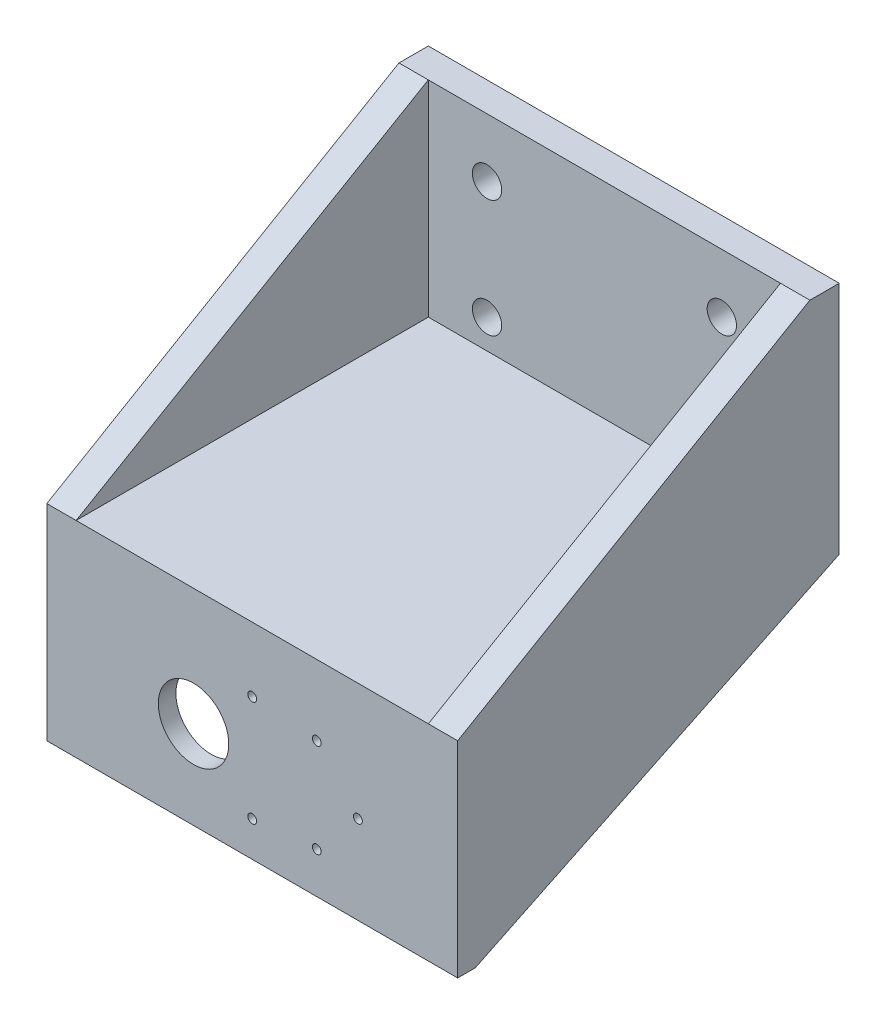
ISO-10303-21;
HEADER;
FILE_DESCRIPTION(('STEP AP214'),'2;1');
FILE_NAME('part.step','',(''),(''),'','','');
FILE_SCHEMA(('AUTOMOTIVE_DESIGN { 1 0 10303 214 1 1 1 1 }'));
ENDSEC;
DATA;
#1=APPLICATION_CONTEXT('core data for automotive mechanical design processes');
#2=APPLICATION_PROTOCOL_DEFINITION('international standard','automotive_design',2000,#1);
#3=PRODUCT_CONTEXT('',#1,'mechanical');
#4=PRODUCT('Part','Part','',(#3));
#5=PRODUCT_RELATED_PRODUCT_CATEGORY('part','',(#4));
#6=PRODUCT_DEFINITION_FORMATION('','',#4);
#7=PRODUCT_DEFINITION_CONTEXT('part definition',#1,'design');
#8=PRODUCT_DEFINITION('design','',#6,#7);
#9=PRODUCT_DEFINITION_SHAPE('','',#8);
#10=(LENGTH_UNIT() NAMED_UNIT(*) SI_UNIT(.MILLI.,.METRE.));
#11=(NAMED_UNIT(*) PLANE_ANGLE_UNIT() SI_UNIT($,.RADIAN.));
#12=(NAMED_UNIT(*) SI_UNIT($,.STERADIAN.) SOLID_ANGLE_UNIT());
#13=UNCERTAINTY_MEASURE_WITH_UNIT(LENGTH_MEASURE(1.E-05),#10,'distance_accuracy_value','');
#14=(GEOMETRIC_REPRESENTATION_CONTEXT(3) GLOBAL_UNCERTAINTY_ASSIGNED_CONTEXT((#13)) GLOBAL_UNIT_ASSIGNED_CONTEXT((#10,
#11,#12)) REPRESENTATION_CONTEXT('',''));
#15=CARTESIAN_POINT('',(0.,0.,0.));
#16=DIRECTION('',(0.,0.,1.));
#17=DIRECTION('',(1.,0.,0.));
#18=AXIS2_PLACEMENT_3D('',#15,#16,#17);
#19=CARTESIAN_POINT('',(0.,0.,5.));
#20=DIRECTION('',(0.,0.,1.));
#21=DIRECTION('',(1.,0.,0.));
#22=AXIS2_PLACEMENT_3D('',#19,#20,#21);
#23=PLANE('',#22);
#24=CARTESIAN_POINT('',(-20.,-10.,5.));
#25=DIRECTION('',(0.,0.,1.));
#26=DIRECTION('',(1.,0.,0.));
#27=AXIS2_PLACEMENT_3D('',#24,#25,#26);
#28=CIRCLE('',#27,2.5);
#29=CARTESIAN_POINT('',(-17.5,-10.,5.));
#30=VERTEX_POINT('',#29);
#31=EDGE_CURVE('E263',#30,#30,#28,.T.);
#32=ORIENTED_EDGE('',*,*,#31,.F.);
#33=EDGE_LOOP('',(#32));
#34=FACE_BOUND('',#33,.T.);
#35=CARTESIAN_POINT('',(-20.,9.99999999999999,5.));
#36=DIRECTION('',(0.,0.,1.));
#37=DIRECTION('',(1.,0.,0.));
#38=AXIS2_PLACEMENT_3D('',#35,#36,#37);
#39=CIRCLE('',#38,2.5);
#40=CARTESIAN_POINT('',(-17.5,9.99999999999999,5.));
#41=VERTEX_POINT('',#40);
#42=EDGE_CURVE('E275',#41,#41,#39,.T.);
#43=ORIENTED_EDGE('',*,*,#42,.F.);
#44=EDGE_LOOP('',(#43));
#45=FACE_BOUND('',#44,.T.);
#46=CARTESIAN_POINT('',(20.,9.99999999999999,5.));
#47=DIRECTION('',(0.,0.,1.));
#48=DIRECTION('',(1.,0.,0.));
#49=AXIS2_PLACEMENT_3D('',#46,#47,#48);
#50=CIRCLE('',#49,2.5);
#51=CARTESIAN_POINT('',(22.5,9.99999999999999,5.));
#52=VERTEX_POINT('',#51);
#53=EDGE_CURVE('E269',#52,#52,#50,.T.);
#54=ORIENTED_EDGE('',*,*,#53,.F.);
#55=EDGE_LOOP('',(#54));
#56=FACE_BOUND('',#55,.T.);
#57=CARTESIAN_POINT('',(20.,-10.,5.));
#58=DIRECTION('',(0.,0.,1.));
#59=DIRECTION('',(1.,0.,0.));
#60=AXIS2_PLACEMENT_3D('',#57,#58,#59);
#61=CIRCLE('',#60,2.5);
#62=CARTESIAN_POINT('',(22.5,-10.,5.));
#63=VERTEX_POINT('',#62);
#64=EDGE_CURVE('E257',#63,#63,#61,.T.);
#65=ORIENTED_EDGE('',*,*,#64,.F.);
#66=EDGE_LOOP('',(#65));
#67=FACE_BOUND('',#66,.T.);
#68=DIRECTION('',(-1.,0.,0.));
#69=VECTOR('',#68,1.);
#70=CARTESIAN_POINT('',(35.,20.,5.));
#71=LINE('',#70,#69);
#72=CARTESIAN_POINT('',(30.,20.,5.));
#73=VERTEX_POINT('',#72);
#74=CARTESIAN_POINT('',(-30.,20.,5.));
#75=VERTEX_POINT('',#74);
#76=EDGE_CURVE('E159',#73,#75,#71,.T.);
#77=ORIENTED_EDGE('',*,*,#76,.T.);
#78=DIRECTION('',(0.,-1.,0.));
#79=VECTOR('',#78,1.);
#80=CARTESIAN_POINT('',(-30.,0.,5.));
#81=LINE('',#80,#79);
#82=CARTESIAN_POINT('',(-30.,-15.,5.));
#83=VERTEX_POINT('',#82);
#84=EDGE_CURVE('E240',#75,#83,#81,.T.);
#85=ORIENTED_EDGE('',*,*,#84,.T.);
#86=DIRECTION('',(1.,0.,0.));
#87=VECTOR('',#86,1.);
#88=CARTESIAN_POINT('',(0.,-15.,5.));
#89=LINE('',#88,#87);
#90=CARTESIAN_POINT('',(30.,-15.,5.));
#91=VERTEX_POINT('',#90);
#92=EDGE_CURVE('E248',#83,#91,#89,.T.);
#93=ORIENTED_EDGE('',*,*,#92,.T.);
#94=DIRECTION('',(0.,-1.,0.));
#95=VECTOR('',#94,1.);
#96=CARTESIAN_POINT('',(30.,0.,5.));
#97=LINE('',#96,#95);
#98=EDGE_CURVE('E235',#73,#91,#97,.T.);
#99=ORIENTED_EDGE('',*,*,#98,.F.);
#100=EDGE_LOOP('',(#77,#85,#93,#99));
#101=FACE_BOUND('',#100,.T.);
#102=ADVANCED_FACE('F42',(#34,#45,#56,#67,#101),#23,.T.);
#103=CARTESIAN_POINT('',(0.,0.,0.));
#104=DIRECTION('',(0.,0.,1.));
#105=DIRECTION('',(1.,0.,0.));
#106=AXIS2_PLACEMENT_3D('',#103,#104,#105);
#107=PLANE('',#106);
#108=DIRECTION('',(0.,1.,0.));
#109=VECTOR('',#108,1.);
#110=CARTESIAN_POINT('',(35.,-20.,0.));
#111=LINE('',#110,#109);
#112=CARTESIAN_POINT('',(35.,-20.,0.));
#113=VERTEX_POINT('',#112);
#114=CARTESIAN_POINT('',(35.,20.,0.));
#115=VERTEX_POINT('',#114);
#116=EDGE_CURVE('E144',#113,#115,#111,.T.);
#117=ORIENTED_EDGE('',*,*,#116,.F.);
#118=DIRECTION('',(-1.,0.,0.));
#119=VECTOR('',#118,1.);
#120=CARTESIAN_POINT('',(35.,-20.,0.));
#121=LINE('',#120,#119);
#122=CARTESIAN_POINT('',(30.,-20.,0.));
#123=VERTEX_POINT('',#122);
#124=EDGE_CURVE('E131',#113,#123,#121,.T.);
#125=ORIENTED_EDGE('',*,*,#124,.T.);
#126=DIRECTION('',(1.,0.,0.));
#127=VECTOR('',#126,1.);
#128=CARTESIAN_POINT('',(35.,-20.,0.));
#129=LINE('',#128,#127);
#130=CARTESIAN_POINT('',(-30.,-20.,0.));
#131=VERTEX_POINT('',#130);
#132=EDGE_CURVE('E157',#131,#123,#129,.T.);
#133=ORIENTED_EDGE('',*,*,#132,.F.);
#134=CARTESIAN_POINT('',(-35.,-20.,0.));
#135=VERTEX_POINT('',#134);
#136=EDGE_CURVE('E138',#131,#135,#121,.T.);
#137=ORIENTED_EDGE('',*,*,#136,.T.);
#138=DIRECTION('',(0.,-1.,0.));
#139=VECTOR('',#138,1.);
#140=CARTESIAN_POINT('',(-35.,-20.,0.));
#141=LINE('',#140,#139);
#142=CARTESIAN_POINT('',(-35.,20.,0.));
#143=VERTEX_POINT('',#142);
#144=EDGE_CURVE('E161',#143,#135,#141,.T.);
#145=ORIENTED_EDGE('',*,*,#144,.F.);
#146=DIRECTION('',(-1.,0.,0.));
#147=VECTOR('',#146,1.);
#148=CARTESIAN_POINT('',(35.,20.,0.));
#149=LINE('',#148,#147);
#150=EDGE_CURVE('E156',#115,#143,#149,.T.);
#151=ORIENTED_EDGE('',*,*,#150,.F.);
#152=EDGE_LOOP('',(#117,#125,#133,#137,#145,#151));
#153=FACE_BOUND('',#152,.T.);
#154=CARTESIAN_POINT('',(-20.,9.99999999999999,0.));
#155=DIRECTION('',(0.,0.,1.));
#156=DIRECTION('',(1.,0.,0.));
#157=AXIS2_PLACEMENT_3D('',#154,#155,#156);
#158=CIRCLE('',#157,2.5);
#159=CARTESIAN_POINT('',(-17.5,9.99999999999999,0.));
#160=VERTEX_POINT('',#159);
#161=EDGE_CURVE('E272',#160,#160,#158,.T.);
#162=ORIENTED_EDGE('',*,*,#161,.T.);
#163=EDGE_LOOP('',(#162));
#164=FACE_BOUND('',#163,.T.);
#165=CARTESIAN_POINT('',(20.,9.99999999999999,0.));
#166=DIRECTION('',(0.,0.,1.));
#167=DIRECTION('',(1.,0.,0.));
#168=AXIS2_PLACEMENT_3D('',#165,#166,#167);
#169=CIRCLE('',#168,2.5);
#170=CARTESIAN_POINT('',(22.5,9.99999999999999,0.));
#171=VERTEX_POINT('',#170);
#172=EDGE_CURVE('E266',#171,#171,#169,.T.);
#173=ORIENTED_EDGE('',*,*,#172,.T.);
#174=EDGE_LOOP('',(#173));
#175=FACE_BOUND('',#174,.T.);
#176=CARTESIAN_POINT('',(-20.,-10.,0.));
#177=DIRECTION('',(0.,0.,1.));
#178=DIRECTION('',(1.,0.,0.));
#179=AXIS2_PLACEMENT_3D('',#176,#177,#178);
#180=CIRCLE('',#179,2.5);
#181=CARTESIAN_POINT('',(-17.5,-10.,0.));
#182=VERTEX_POINT('',#181);
#183=EDGE_CURVE('E260',#182,#182,#180,.T.);
#184=ORIENTED_EDGE('',*,*,#183,.T.);
#185=EDGE_LOOP('',(#184));
#186=FACE_BOUND('',#185,.T.);
#187=CARTESIAN_POINT('',(20.,-10.,0.));
#188=DIRECTION('',(0.,0.,1.));
#189=DIRECTION('',(1.,0.,0.));
#190=AXIS2_PLACEMENT_3D('',#187,#188,#189);
#191=CIRCLE('',#190,2.5);
#192=CARTESIAN_POINT('',(22.5,-10.,0.));
#193=VERTEX_POINT('',#192);
#194=EDGE_CURVE('E256',#193,#193,#191,.T.);
#195=ORIENTED_EDGE('',*,*,#194,.T.);
#196=EDGE_LOOP('',(#195));
#197=FACE_BOUND('',#196,.T.);
#198=ADVANCED_FACE('F152',(#153,#164,#175,#186,#197),#107,.F.);
#199=CARTESIAN_POINT('',(-35.,-20.,5.));
#200=DIRECTION('',(1.,0.,0.));
#201=DIRECTION('',(0.,0.,-1.));
#202=AXIS2_PLACEMENT_3D('',#199,#200,#201);
#203=PLANE('',#202);
#204=ORIENTED_EDGE('',*,*,#144,.T.);
#205=DIRECTION('',(0.,0.435560928104281,-0.900159251415513));
#206=VECTOR('',#205,1.);
#207=CARTESIAN_POINT('',(-35.,-50.,62.));
#208=LINE('',#207,#206);
#209=CARTESIAN_POINT('',(-35.,-50.,62.));
#210=VERTEX_POINT('',#209);
#211=EDGE_CURVE('E149',#210,#135,#208,.T.);
#212=ORIENTED_EDGE('',*,*,#211,.F.);
#213=DIRECTION('',(0.,0.,-1.));
#214=VECTOR('',#213,1.);
#215=CARTESIAN_POINT('',(-35.,-50.,0.));
#216=LINE('',#215,#214);
#217=CARTESIAN_POINT('',(-35.,-50.,65.));
#218=VERTEX_POINT('',#217);
#219=EDGE_CURVE('E209',#218,#210,#216,.T.);
#220=ORIENTED_EDGE('',*,*,#219,.F.);
#221=DIRECTION('',(0.,-1.,0.));
#222=VECTOR('',#221,1.);
#223=CARTESIAN_POINT('',(-35.,0.,65.));
#224=LINE('',#223,#222);
#225=CARTESIAN_POINT('',(-35.,-15.,65.));
#226=VERTEX_POINT('',#225);
#227=EDGE_CURVE('E239',#226,#218,#224,.T.);
#228=ORIENTED_EDGE('',*,*,#227,.F.);
#229=DIRECTION('',(0.,-0.503871025524086,0.863778900898433));
#230=VECTOR('',#229,1.);
#231=CARTESIAN_POINT('',(-35.,20.,5.));
#232=LINE('',#231,#230);
#233=CARTESIAN_POINT('',(-35.,20.,5.));
#234=VERTEX_POINT('',#233);
#235=EDGE_CURVE('E222',#234,#226,#232,.T.);
#236=ORIENTED_EDGE('',*,*,#235,.F.);
#237=DIRECTION('',(0.,0.,-1.));
#238=VECTOR('',#237,1.);
#239=CARTESIAN_POINT('',(-35.,20.,5.));
#240=LINE('',#239,#238);
#241=EDGE_CURVE('E165',#234,#143,#240,.T.);
#242=ORIENTED_EDGE('',*,*,#241,.T.);
#243=EDGE_LOOP('',(#204,#212,#220,#228,#236,#242));
#244=FACE_BOUND('',#243,.T.);
#245=ADVANCED_FACE('F44',(#244),#203,.F.);
#246=CARTESIAN_POINT('',(35.,-20.,5.));
#247=DIRECTION('',(0.,1.,0.));
#248=DIRECTION('',(-1.,0.,0.));
#249=AXIS2_PLACEMENT_3D('',#246,#247,#248);
#250=PLANE('',#249);
#251=ORIENTED_EDGE('',*,*,#132,.T.);
#252=DIRECTION('',(0.,0.,1.));
#253=VECTOR('',#252,1.);
#254=CARTESIAN_POINT('',(30.,-20.,0.));
#255=LINE('',#254,#253);
#256=CARTESIAN_POINT('',(30.,-20.,62.));
#257=VERTEX_POINT('',#256);
#258=EDGE_CURVE('E67',#123,#257,#255,.T.);
#259=ORIENTED_EDGE('',*,*,#258,.T.);
#260=DIRECTION('',(-1.,0.,0.));
#261=VECTOR('',#260,1.);
#262=CARTESIAN_POINT('',(0.,-20.,62.));
#263=LINE('',#262,#261);
#264=CARTESIAN_POINT('',(-30.,-20.,62.));
#265=VERTEX_POINT('',#264);
#266=EDGE_CURVE('E215',#257,#265,#263,.T.);
#267=ORIENTED_EDGE('',*,*,#266,.T.);
#268=DIRECTION('',(0.,0.,1.));
#269=VECTOR('',#268,1.);
#270=CARTESIAN_POINT('',(-30.,-20.,0.));
#271=LINE('',#270,#269);
#272=EDGE_CURVE('E201',#131,#265,#271,.T.);
#273=ORIENTED_EDGE('',*,*,#272,.F.);
#274=EDGE_LOOP('',(#251,#259,#267,#273));
#275=FACE_BOUND('',#274,.T.);
#276=ADVANCED_FACE('F292',(#275),#250,.F.);
#277=CARTESIAN_POINT('',(35.,-20.,5.));
#278=DIRECTION('',(-1.,0.,0.));
#279=DIRECTION('',(0.,0.,1.));
#280=AXIS2_PLACEMENT_3D('',#277,#278,#279);
#281=PLANE('',#280);
#282=DIRECTION('',(0.,0.,1.));
#283=VECTOR('',#282,1.);
#284=CARTESIAN_POINT('',(35.,-50.,0.));
#285=LINE('',#284,#283);
#286=CARTESIAN_POINT('',(35.,-50.,62.));
#287=VERTEX_POINT('',#286);
#288=CARTESIAN_POINT('',(35.,-50.,65.));
#289=VERTEX_POINT('',#288);
#290=EDGE_CURVE('E147',#287,#289,#285,.T.);
#291=ORIENTED_EDGE('',*,*,#290,.F.);
#292=DIRECTION('',(0.,0.435560928104281,-0.900159251415513));
#293=VECTOR('',#292,1.);
#294=CARTESIAN_POINT('',(35.,-50.,62.));
#295=LINE('',#294,#293);
#296=EDGE_CURVE('E59',#287,#113,#295,.T.);
#297=ORIENTED_EDGE('',*,*,#296,.T.);
#298=ORIENTED_EDGE('',*,*,#116,.T.);
#299=DIRECTION('',(0.,0.,-1.));
#300=VECTOR('',#299,1.);
#301=CARTESIAN_POINT('',(35.,20.,5.));
#302=LINE('',#301,#300);
#303=CARTESIAN_POINT('',(35.,20.,5.));
#304=VERTEX_POINT('',#303);
#305=EDGE_CURVE('E167',#304,#115,#302,.T.);
#306=ORIENTED_EDGE('',*,*,#305,.F.);
#307=DIRECTION('',(0.,-0.503871025524086,0.863778900898434));
#308=VECTOR('',#307,1.);
#309=CARTESIAN_POINT('',(35.,9.84455958549222,22.4093264248705));
#310=LINE('',#309,#308);
#311=CARTESIAN_POINT('',(35.,-15.,65.));
#312=VERTEX_POINT('',#311);
#313=EDGE_CURVE('E232',#304,#312,#310,.T.);
#314=ORIENTED_EDGE('',*,*,#313,.T.);
#315=DIRECTION('',(0.,1.,0.));
#316=VECTOR('',#315,1.);
#317=CARTESIAN_POINT('',(35.,0.,65.));
#318=LINE('',#317,#316);
#319=EDGE_CURVE('E242',#289,#312,#318,.T.);
#320=ORIENTED_EDGE('',*,*,#319,.F.);
#321=EDGE_LOOP('',(#291,#297,#298,#306,#314,#320));
#322=FACE_BOUND('',#321,.T.);
#323=ADVANCED_FACE('F142',(#322),#281,.F.);
#324=CARTESIAN_POINT('',(35.,20.,5.));
#325=DIRECTION('',(0.,-1.,0.));
#326=DIRECTION('',(1.,0.,0.));
#327=AXIS2_PLACEMENT_3D('',#324,#325,#326);
#328=PLANE('',#327);
#329=ORIENTED_EDGE('',*,*,#241,.F.);
#330=DIRECTION('',(-1.,0.,0.));
#331=VECTOR('',#330,1.);
#332=CARTESIAN_POINT('',(65.,20.,5.));
#333=LINE('',#332,#331);
#334=EDGE_CURVE('E224',#75,#234,#333,.T.);
#335=ORIENTED_EDGE('',*,*,#334,.F.);
#336=ORIENTED_EDGE('',*,*,#76,.F.);
#337=EDGE_CURVE('E226',#304,#73,#333,.T.);
#338=ORIENTED_EDGE('',*,*,#337,.F.);
#339=ORIENTED_EDGE('',*,*,#305,.T.);
#340=ORIENTED_EDGE('',*,*,#150,.T.);
#341=EDGE_LOOP('',(#329,#335,#336,#338,#339,#340));
#342=FACE_BOUND('',#341,.T.);
#343=ADVANCED_FACE('F324',(#342),#328,.F.);
#344=CARTESIAN_POINT('',(-20.,9.99999999999999,5.));
#345=DIRECTION('',(0.,0.,-1.));
#346=DIRECTION('',(-1.,0.,0.));
#347=AXIS2_PLACEMENT_3D('',#344,#345,#346);
#348=CYLINDRICAL_SURFACE('',#347,2.5);
#349=ORIENTED_EDGE('',*,*,#42,.T.);
#350=EDGE_LOOP('',(#349));
#351=FACE_BOUND('',#350,.T.);
#352=ORIENTED_EDGE('',*,*,#161,.F.);
#353=EDGE_LOOP('',(#352));
#354=FACE_BOUND('',#353,.T.);
#355=ADVANCED_FACE('F348',(#351,#354),#348,.F.);
#356=CARTESIAN_POINT('',(20.,9.99999999999999,5.));
#357=DIRECTION('',(0.,0.,-1.));
#358=DIRECTION('',(-1.,0.,0.));
#359=AXIS2_PLACEMENT_3D('',#356,#357,#358);
#360=CYLINDRICAL_SURFACE('',#359,2.5);
#361=ORIENTED_EDGE('',*,*,#53,.T.);
#362=EDGE_LOOP('',(#361));
#363=FACE_BOUND('',#362,.T.);
#364=ORIENTED_EDGE('',*,*,#172,.F.);
#365=EDGE_LOOP('',(#364));
#366=FACE_BOUND('',#365,.T.);
#367=ADVANCED_FACE('F436',(#363,#366),#360,.F.);
#368=CARTESIAN_POINT('',(-20.,-10.,5.));
#369=DIRECTION('',(0.,0.,-1.));
#370=DIRECTION('',(-1.,0.,0.));
#371=AXIS2_PLACEMENT_3D('',#368,#369,#370);
#372=CYLINDRICAL_SURFACE('',#371,2.5);
#373=ORIENTED_EDGE('',*,*,#31,.T.);
#374=EDGE_LOOP('',(#373));
#375=FACE_BOUND('',#374,.T.);
#376=ORIENTED_EDGE('',*,*,#183,.F.);
#377=EDGE_LOOP('',(#376));
#378=FACE_BOUND('',#377,.T.);
#379=ADVANCED_FACE('F426',(#375,#378),#372,.F.);
#380=CARTESIAN_POINT('',(20.,-10.,5.));
#381=DIRECTION('',(0.,0.,-1.));
#382=DIRECTION('',(-1.,0.,0.));
#383=AXIS2_PLACEMENT_3D('',#380,#381,#382);
#384=CYLINDRICAL_SURFACE('',#383,2.5);
#385=ORIENTED_EDGE('',*,*,#64,.T.);
#386=EDGE_LOOP('',(#385));
#387=FACE_BOUND('',#386,.T.);
#388=ORIENTED_EDGE('',*,*,#194,.F.);
#389=EDGE_LOOP('',(#388));
#390=FACE_BOUND('',#389,.T.);
#391=ADVANCED_FACE('F404',(#387,#390),#384,.F.);
#392=CARTESIAN_POINT('',(30.,0.,65.));
#393=DIRECTION('',(1.,0.,0.));
#394=DIRECTION('',(0.,1.,0.));
#395=AXIS2_PLACEMENT_3D('',#392,#393,#394);
#396=PLANE('',#395);
#397=DIRECTION('',(0.,0.,-1.));
#398=VECTOR('',#397,1.);
#399=CARTESIAN_POINT('',(30.,-15.,65.));
#400=LINE('',#399,#398);
#401=CARTESIAN_POINT('',(30.,-15.,65.));
#402=VERTEX_POINT('',#401);
#403=EDGE_CURVE('E253',#402,#91,#400,.T.);
#404=ORIENTED_EDGE('',*,*,#403,.F.);
#405=DIRECTION('',(0.,0.503871025524086,-0.863778900898434));
#406=VECTOR('',#405,1.);
#407=CARTESIAN_POINT('',(30.,-11.1917098445596,58.4715025906736));
#408=LINE('',#407,#406);
#409=EDGE_CURVE('E229',#402,#73,#408,.T.);
#410=ORIENTED_EDGE('',*,*,#409,.T.);
#411=ORIENTED_EDGE('',*,*,#98,.T.);
#412=EDGE_LOOP('',(#404,#410,#411));
#413=FACE_BOUND('',#412,.T.);
#414=ADVANCED_FACE('F327',(#413),#396,.F.);
#415=CARTESIAN_POINT('',(0.,-15.,65.));
#416=DIRECTION('',(0.,1.,0.));
#417=DIRECTION('',(0.,0.,1.));
#418=AXIS2_PLACEMENT_3D('',#415,#416,#417);
#419=PLANE('',#418);
#420=ORIENTED_EDGE('',*,*,#92,.F.);
#421=DIRECTION('',(0.,0.,-1.));
#422=VECTOR('',#421,1.);
#423=CARTESIAN_POINT('',(-30.,-15.,65.));
#424=LINE('',#423,#422);
#425=CARTESIAN_POINT('',(-30.,-15.,65.));
#426=VERTEX_POINT('',#425);
#427=EDGE_CURVE('E245',#426,#83,#424,.T.);
#428=ORIENTED_EDGE('',*,*,#427,.F.);
#429=DIRECTION('',(1.,0.,0.));
#430=VECTOR('',#429,1.);
#431=CARTESIAN_POINT('',(0.,-15.,65.));
#432=LINE('',#431,#430);
#433=EDGE_CURVE('E236',#426,#402,#432,.T.);
#434=ORIENTED_EDGE('',*,*,#433,.T.);
#435=ORIENTED_EDGE('',*,*,#403,.T.);
#436=EDGE_LOOP('',(#420,#428,#434,#435));
#437=FACE_BOUND('',#436,.T.);
#438=ADVANCED_FACE('F317',(#437),#419,.T.);
#439=CARTESIAN_POINT('',(-30.,0.,65.));
#440=DIRECTION('',(1.,0.,0.));
#441=DIRECTION('',(0.,1.,0.));
#442=AXIS2_PLACEMENT_3D('',#439,#440,#441);
#443=PLANE('',#442);
#444=DIRECTION('',(0.,0.503871025524086,-0.863778900898434));
#445=VECTOR('',#444,1.);
#446=CARTESIAN_POINT('',(-30.,-11.1917098445596,58.4715025906736));
#447=LINE('',#446,#445);
#448=EDGE_CURVE('E227',#426,#75,#447,.T.);
#449=ORIENTED_EDGE('',*,*,#448,.F.);
#450=ORIENTED_EDGE('',*,*,#427,.T.);
#451=ORIENTED_EDGE('',*,*,#84,.F.);
#452=EDGE_LOOP('',(#449,#450,#451));
#453=FACE_BOUND('',#452,.T.);
#454=ADVANCED_FACE('F314',(#453),#443,.T.);
#455=CARTESIAN_POINT('',(0.,0.,65.));
#456=DIRECTION('',(0.,0.,1.));
#457=DIRECTION('',(1.,0.,0.));
#458=AXIS2_PLACEMENT_3D('',#455,#456,#457);
#459=PLANE('',#458);
#460=CARTESIAN_POINT('',(-10.,-35.,65.));
#461=DIRECTION('',(0.,0.,1.));
#462=DIRECTION('',(1.,0.,0.));
#463=AXIS2_PLACEMENT_3D('',#460,#461,#462);
#464=CIRCLE('',#463,6.);
#465=CARTESIAN_POINT('',(-4.,-35.,65.));
#466=VERTEX_POINT('',#465);
#467=EDGE_CURVE('E175',#466,#466,#464,.T.);
#468=ORIENTED_EDGE('',*,*,#467,.F.);
#469=EDGE_LOOP('',(#468));
#470=FACE_BOUND('',#469,.T.);
#471=CARTESIAN_POINT('',(0.,-26.,65.));
#472=DIRECTION('',(0.,0.,1.));
#473=DIRECTION('',(1.,0.,0.));
#474=AXIS2_PLACEMENT_3D('',#471,#472,#473);
#475=CIRCLE('',#474,0.750000000000001);
#476=CARTESIAN_POINT('',(0.749999999999998,-26.,65.));
#477=VERTEX_POINT('',#476);
#478=EDGE_CURVE('E634',#477,#477,#475,.T.);
#479=ORIENTED_EDGE('',*,*,#478,.F.);
#480=EDGE_LOOP('',(#479));
#481=FACE_BOUND('',#480,.T.);
#482=CARTESIAN_POINT('',(18.,-35.,65.));
#483=DIRECTION('',(0.,0.,1.));
#484=DIRECTION('',(1.,0.,0.));
#485=AXIS2_PLACEMENT_3D('',#482,#483,#484);
#486=CIRCLE('',#485,0.750000000000002);
#487=CARTESIAN_POINT('',(18.75,-35.,65.));
#488=VERTEX_POINT('',#487);
#489=EDGE_CURVE('E628',#488,#488,#486,.T.);
#490=ORIENTED_EDGE('',*,*,#489,.F.);
#491=EDGE_LOOP('',(#490));
#492=FACE_BOUND('',#491,.T.);
#493=CARTESIAN_POINT('',(11.,-43.,65.));
#494=DIRECTION('',(0.,0.,1.));
#495=DIRECTION('',(1.,0.,0.));
#496=AXIS2_PLACEMENT_3D('',#493,#494,#495);
#497=CIRCLE('',#496,0.75);
#498=CARTESIAN_POINT('',(11.75,-43.,65.));
#499=VERTEX_POINT('',#498);
#500=EDGE_CURVE('E631',#499,#499,#497,.T.);
#501=ORIENTED_EDGE('',*,*,#500,.F.);
#502=EDGE_LOOP('',(#501));
#503=FACE_BOUND('',#502,.T.);
#504=CARTESIAN_POINT('',(0.,-44.,65.));
#505=DIRECTION('',(0.,0.,1.));
#506=DIRECTION('',(1.,0.,0.));
#507=AXIS2_PLACEMENT_3D('',#504,#505,#506);
#508=CIRCLE('',#507,0.750000000000001);
#509=CARTESIAN_POINT('',(0.749999999999998,-44.,65.));
#510=VERTEX_POINT('',#509);
#511=EDGE_CURVE('E638',#510,#510,#508,.T.);
#512=ORIENTED_EDGE('',*,*,#511,.F.);
#513=EDGE_LOOP('',(#512));
#514=FACE_BOUND('',#513,.T.);
#515=CARTESIAN_POINT('',(11.,-27.,65.));
#516=DIRECTION('',(0.,0.,1.));
#517=DIRECTION('',(1.,0.,0.));
#518=AXIS2_PLACEMENT_3D('',#515,#516,#517);
#519=CIRCLE('',#518,0.75);
#520=CARTESIAN_POINT('',(11.75,-27.,65.));
#521=VERTEX_POINT('',#520);
#522=EDGE_CURVE('E637',#521,#521,#519,.T.);
#523=ORIENTED_EDGE('',*,*,#522,.F.);
#524=EDGE_LOOP('',(#523));
#525=FACE_BOUND('',#524,.T.);
#526=DIRECTION('',(1.,0.,0.));
#527=VECTOR('',#526,1.);
#528=CARTESIAN_POINT('',(0.,-15.,65.));
#529=LINE('',#528,#527);
#530=EDGE_CURVE('E51',#226,#426,#529,.T.);
#531=ORIENTED_EDGE('',*,*,#530,.F.);
#532=ORIENTED_EDGE('',*,*,#227,.T.);
#533=DIRECTION('',(-1.,0.,0.));
#534=VECTOR('',#533,1.);
#535=CARTESIAN_POINT('',(0.,-50.,65.));
#536=LINE('',#535,#534);
#537=EDGE_CURVE('E206',#289,#218,#536,.T.);
#538=ORIENTED_EDGE('',*,*,#537,.F.);
#539=ORIENTED_EDGE('',*,*,#319,.T.);
#540=EDGE_CURVE('E169',#402,#312,#529,.T.);
#541=ORIENTED_EDGE('',*,*,#540,.F.);
#542=ORIENTED_EDGE('',*,*,#433,.F.);
#543=EDGE_LOOP('',(#531,#532,#538,#539,#541,#542));
#544=FACE_BOUND('',#543,.T.);
#545=ADVANCED_FACE('F304',(#470,#481,#492,#503,#514,#525,#544),#459,.T.);
#546=CARTESIAN_POINT('',(65.,20.,5.));
#547=DIRECTION('',(0.,-0.863778900898433,-0.503871025524086));
#548=DIRECTION('',(0.,0.503871025524086,-0.863778900898434));
#549=AXIS2_PLACEMENT_3D('',#546,#547,#548);
#550=PLANE('',#549);
#551=ORIENTED_EDGE('',*,*,#337,.T.);
#552=ORIENTED_EDGE('',*,*,#409,.F.);
#553=ORIENTED_EDGE('',*,*,#540,.T.);
#554=ORIENTED_EDGE('',*,*,#313,.F.);
#555=EDGE_LOOP('',(#551,#552,#553,#554));
#556=FACE_BOUND('',#555,.T.);
#557=ADVANCED_FACE('F328',(#556),#550,.F.);
#558=ORIENTED_EDGE('',*,*,#448,.T.);
#559=ORIENTED_EDGE('',*,*,#334,.T.);
#560=ORIENTED_EDGE('',*,*,#235,.T.);
#561=ORIENTED_EDGE('',*,*,#530,.T.);
#562=EDGE_LOOP('',(#558,#559,#560,#561));
#563=FACE_BOUND('',#562,.T.);
#564=ADVANCED_FACE('F309',(#563),#550,.F.);
#565=CARTESIAN_POINT('',(-30.,-50.,0.));
#566=DIRECTION('',(-1.,0.,0.));
#567=DIRECTION('',(0.,-1.,0.));
#568=AXIS2_PLACEMENT_3D('',#565,#566,#567);
#569=PLANE('',#568);
#570=DIRECTION('',(0.,1.,0.));
#571=VECTOR('',#570,1.);
#572=CARTESIAN_POINT('',(-30.,-50.,62.));
#573=LINE('',#572,#571);
#574=CARTESIAN_POINT('',(-30.,-50.,62.));
#575=VERTEX_POINT('',#574);
#576=EDGE_CURVE('E219',#575,#265,#573,.T.);
#577=ORIENTED_EDGE('',*,*,#576,.F.);
#578=DIRECTION('',(0.,0.435560928104281,-0.900159251415514));
#579=VECTOR('',#578,1.);
#580=CARTESIAN_POINT('',(-30.,-25.6913996627319,11.7622259696459));
#581=LINE('',#580,#579);
#582=EDGE_CURVE('E198',#575,#131,#581,.T.);
#583=ORIENTED_EDGE('',*,*,#582,.T.);
#584=ORIENTED_EDGE('',*,*,#272,.T.);
#585=EDGE_LOOP('',(#577,#583,#584));
#586=FACE_BOUND('',#585,.T.);
#587=ADVANCED_FACE('F291',(#586),#569,.F.);
#588=CARTESIAN_POINT('',(0.,-50.,62.));
#589=DIRECTION('',(0.,0.,-1.));
#590=DIRECTION('',(-1.,0.,0.));
#591=AXIS2_PLACEMENT_3D('',#588,#589,#590);
#592=PLANE('',#591);
#593=CARTESIAN_POINT('',(-10.,-35.,62.));
#594=DIRECTION('',(0.,0.,-1.));
#595=DIRECTION('',(-1.,0.,0.));
#596=AXIS2_PLACEMENT_3D('',#593,#594,#595);
#597=CIRCLE('',#596,6.);
#598=CARTESIAN_POINT('',(-16.,-35.,62.));
#599=VERTEX_POINT('',#598);
#600=EDGE_CURVE('E46',#599,#599,#597,.T.);
#601=ORIENTED_EDGE('',*,*,#600,.F.);
#602=EDGE_LOOP('',(#601));
#603=FACE_BOUND('',#602,.T.);
#604=CARTESIAN_POINT('',(0.,-26.,62.));
#605=DIRECTION('',(0.,0.,-1.));
#606=DIRECTION('',(-1.,0.,0.));
#607=AXIS2_PLACEMENT_3D('',#604,#605,#606);
#608=CIRCLE('',#607,0.750000000000001);
#609=CARTESIAN_POINT('',(-0.750000000000005,-26.,62.));
#610=VERTEX_POINT('',#609);
#611=EDGE_CURVE('E183',#610,#610,#608,.T.);
#612=ORIENTED_EDGE('',*,*,#611,.F.);
#613=EDGE_LOOP('',(#612));
#614=FACE_BOUND('',#613,.T.);
#615=CARTESIAN_POINT('',(18.,-35.,62.));
#616=DIRECTION('',(0.,0.,-1.));
#617=DIRECTION('',(-1.,0.,0.));
#618=AXIS2_PLACEMENT_3D('',#615,#616,#617);
#619=CIRCLE('',#618,0.750000000000002);
#620=CARTESIAN_POINT('',(17.25,-35.,62.));
#621=VERTEX_POINT('',#620);
#622=EDGE_CURVE('E181',#621,#621,#619,.T.);
#623=ORIENTED_EDGE('',*,*,#622,.F.);
#624=EDGE_LOOP('',(#623));
#625=FACE_BOUND('',#624,.T.);
#626=CARTESIAN_POINT('',(11.,-43.,62.));
#627=DIRECTION('',(0.,0.,-1.));
#628=DIRECTION('',(-1.,0.,0.));
#629=AXIS2_PLACEMENT_3D('',#626,#627,#628);
#630=CIRCLE('',#629,0.75);
#631=CARTESIAN_POINT('',(10.25,-43.,62.));
#632=VERTEX_POINT('',#631);
#633=EDGE_CURVE('E178',#632,#632,#630,.T.);
#634=ORIENTED_EDGE('',*,*,#633,.F.);
#635=EDGE_LOOP('',(#634));
#636=FACE_BOUND('',#635,.T.);
#637=CARTESIAN_POINT('',(0.,-44.,62.));
#638=DIRECTION('',(0.,0.,-1.));
#639=DIRECTION('',(-1.,0.,0.));
#640=AXIS2_PLACEMENT_3D('',#637,#638,#639);
#641=CIRCLE('',#640,0.750000000000001);
#642=CARTESIAN_POINT('',(-0.750000000000004,-44.,62.));
#643=VERTEX_POINT('',#642);
#644=EDGE_CURVE('E174',#643,#643,#641,.T.);
#645=ORIENTED_EDGE('',*,*,#644,.F.);
#646=EDGE_LOOP('',(#645));
#647=FACE_BOUND('',#646,.T.);
#648=CARTESIAN_POINT('',(11.,-27.,62.));
#649=DIRECTION('',(0.,0.,-1.));
#650=DIRECTION('',(-1.,0.,0.));
#651=AXIS2_PLACEMENT_3D('',#648,#649,#650);
#652=CIRCLE('',#651,0.75);
#653=CARTESIAN_POINT('',(10.25,-27.,62.));
#654=VERTEX_POINT('',#653);
#655=EDGE_CURVE('E171',#654,#654,#652,.T.);
#656=ORIENTED_EDGE('',*,*,#655,.F.);
#657=EDGE_LOOP('',(#656));
#658=FACE_BOUND('',#657,.T.);
#659=ORIENTED_EDGE('',*,*,#266,.F.);
#660=DIRECTION('',(0.,1.,0.));
#661=VECTOR('',#660,1.);
#662=CARTESIAN_POINT('',(30.,-50.,62.));
#663=LINE('',#662,#661);
#664=CARTESIAN_POINT('',(30.,-50.,62.));
#665=VERTEX_POINT('',#664);
#666=EDGE_CURVE('E212',#665,#257,#663,.T.);
#667=ORIENTED_EDGE('',*,*,#666,.F.);
#668=DIRECTION('',(-1.,0.,0.));
#669=VECTOR('',#668,1.);
#670=CARTESIAN_POINT('',(0.,-50.,62.));
#671=LINE('',#670,#669);
#672=EDGE_CURVE('E202',#665,#575,#671,.T.);
#673=ORIENTED_EDGE('',*,*,#672,.T.);
#674=ORIENTED_EDGE('',*,*,#576,.T.);
#675=EDGE_LOOP('',(#659,#667,#673,#674));
#676=FACE_BOUND('',#675,.T.);
#677=ADVANCED_FACE('F296',(#603,#614,#625,#636,#647,#658,#676),#592,.T.);
#678=CARTESIAN_POINT('',(30.,-50.,0.));
#679=DIRECTION('',(-1.,0.,0.));
#680=DIRECTION('',(0.,-1.,0.));
#681=AXIS2_PLACEMENT_3D('',#678,#679,#680);
#682=PLANE('',#681);
#683=DIRECTION('',(0.,0.435560928104281,-0.900159251415514));
#684=VECTOR('',#683,1.);
#685=CARTESIAN_POINT('',(30.,-25.6913996627319,11.7622259696459));
#686=LINE('',#685,#684);
#687=EDGE_CURVE('E134',#665,#123,#686,.T.);
#688=ORIENTED_EDGE('',*,*,#687,.F.);
#689=ORIENTED_EDGE('',*,*,#666,.T.);
#690=ORIENTED_EDGE('',*,*,#258,.F.);
#691=EDGE_LOOP('',(#688,#689,#690));
#692=FACE_BOUND('',#691,.T.);
#693=ADVANCED_FACE('F532',(#692),#682,.T.);
#694=CARTESIAN_POINT('',(0.,-50.,0.));
#695=DIRECTION('',(0.,-1.,0.));
#696=DIRECTION('',(1.,0.,0.));
#697=AXIS2_PLACEMENT_3D('',#694,#695,#696);
#698=PLANE('',#697);
#699=DIRECTION('',(-1.,0.,0.));
#700=VECTOR('',#699,1.);
#701=CARTESIAN_POINT('',(35.,-50.,62.));
#702=LINE('',#701,#700);
#703=EDGE_CURVE('E148',#287,#665,#702,.T.);
#704=ORIENTED_EDGE('',*,*,#703,.F.);
#705=ORIENTED_EDGE('',*,*,#290,.T.);
#706=ORIENTED_EDGE('',*,*,#537,.T.);
#707=ORIENTED_EDGE('',*,*,#219,.T.);
#708=DIRECTION('',(-1.,0.,0.));
#709=VECTOR('',#708,1.);
#710=CARTESIAN_POINT('',(0.,-50.,62.));
#711=LINE('',#710,#709);
#712=EDGE_CURVE('E11',#575,#210,#711,.T.);
#713=ORIENTED_EDGE('',*,*,#712,.F.);
#714=ORIENTED_EDGE('',*,*,#672,.F.);
#715=EDGE_LOOP('',(#704,#705,#706,#707,#713,#714));
#716=FACE_BOUND('',#715,.T.);
#717=ADVANCED_FACE('F299',(#716),#698,.T.);
#718=CARTESIAN_POINT('',(35.,-50.,62.));
#719=DIRECTION('',(0.,0.900159251415514,0.435560928104281));
#720=DIRECTION('',(0.,-0.435560928104281,0.900159251415514));
#721=AXIS2_PLACEMENT_3D('',#718,#719,#720);
#722=PLANE('',#721);
#723=ORIENTED_EDGE('',*,*,#712,.T.);
#724=ORIENTED_EDGE('',*,*,#211,.T.);
#725=ORIENTED_EDGE('',*,*,#136,.F.);
#726=ORIENTED_EDGE('',*,*,#582,.F.);
#727=EDGE_LOOP('',(#723,#724,#725,#726));
#728=FACE_BOUND('',#727,.T.);
#729=ADVANCED_FACE('F286',(#728),#722,.F.);
#730=ORIENTED_EDGE('',*,*,#687,.T.);
#731=ORIENTED_EDGE('',*,*,#124,.F.);
#732=ORIENTED_EDGE('',*,*,#296,.F.);
#733=ORIENTED_EDGE('',*,*,#703,.T.);
#734=EDGE_LOOP('',(#730,#731,#732,#733));
#735=FACE_BOUND('',#734,.T.);
#736=ADVANCED_FACE('F132',(#735),#722,.F.);
#737=CARTESIAN_POINT('',(11.,-27.,60.));
#738=DIRECTION('',(0.,0.,1.));
#739=DIRECTION('',(1.,0.,0.));
#740=AXIS2_PLACEMENT_3D('',#737,#738,#739);
#741=CYLINDRICAL_SURFACE('',#740,0.75);
#742=ORIENTED_EDGE('',*,*,#655,.T.);
#743=EDGE_LOOP('',(#742));
#744=FACE_BOUND('',#743,.T.);
#745=ORIENTED_EDGE('',*,*,#522,.T.);
#746=EDGE_LOOP('',(#745));
#747=FACE_BOUND('',#746,.T.);
#748=ADVANCED_FACE('F562',(#744,#747),#741,.F.);
#749=CARTESIAN_POINT('',(0.,-44.,60.));
#750=DIRECTION('',(0.,0.,1.));
#751=DIRECTION('',(1.,0.,0.));
#752=AXIS2_PLACEMENT_3D('',#749,#750,#751);
#753=CYLINDRICAL_SURFACE('',#752,0.750000000000001);
#754=ORIENTED_EDGE('',*,*,#644,.T.);
#755=EDGE_LOOP('',(#754));
#756=FACE_BOUND('',#755,.T.);
#757=ORIENTED_EDGE('',*,*,#511,.T.);
#758=EDGE_LOOP('',(#757));
#759=FACE_BOUND('',#758,.T.);
#760=ADVANCED_FACE('F568',(#756,#759),#753,.F.);
#761=CARTESIAN_POINT('',(11.,-43.,60.));
#762=DIRECTION('',(0.,0.,1.));
#763=DIRECTION('',(1.,0.,0.));
#764=AXIS2_PLACEMENT_3D('',#761,#762,#763);
#765=CYLINDRICAL_SURFACE('',#764,0.75);
#766=ORIENTED_EDGE('',*,*,#633,.T.);
#767=EDGE_LOOP('',(#766));
#768=FACE_BOUND('',#767,.T.);
#769=ORIENTED_EDGE('',*,*,#500,.T.);
#770=EDGE_LOOP('',(#769));
#771=FACE_BOUND('',#770,.T.);
#772=ADVANCED_FACE('F577',(#768,#771),#765,.F.);
#773=CARTESIAN_POINT('',(18.,-35.,60.));
#774=DIRECTION('',(0.,0.,1.));
#775=DIRECTION('',(1.,0.,0.));
#776=AXIS2_PLACEMENT_3D('',#773,#774,#775);
#777=CYLINDRICAL_SURFACE('',#776,0.750000000000002);
#778=ORIENTED_EDGE('',*,*,#622,.T.);
#779=EDGE_LOOP('',(#778));
#780=FACE_BOUND('',#779,.T.);
#781=ORIENTED_EDGE('',*,*,#489,.T.);
#782=EDGE_LOOP('',(#781));
#783=FACE_BOUND('',#782,.T.);
#784=ADVANCED_FACE('F586',(#780,#783),#777,.F.);
#785=CARTESIAN_POINT('',(0.,-26.,60.));
#786=DIRECTION('',(0.,0.,1.));
#787=DIRECTION('',(1.,0.,0.));
#788=AXIS2_PLACEMENT_3D('',#785,#786,#787);
#789=CYLINDRICAL_SURFACE('',#788,0.750000000000001);
#790=ORIENTED_EDGE('',*,*,#611,.T.);
#791=EDGE_LOOP('',(#790));
#792=FACE_BOUND('',#791,.T.);
#793=ORIENTED_EDGE('',*,*,#478,.T.);
#794=EDGE_LOOP('',(#793));
#795=FACE_BOUND('',#794,.T.);
#796=ADVANCED_FACE('F595',(#792,#795),#789,.F.);
#797=CARTESIAN_POINT('',(-10.,-35.,60.));
#798=DIRECTION('',(0.,0.,1.));
#799=DIRECTION('',(1.,0.,0.));
#800=AXIS2_PLACEMENT_3D('',#797,#798,#799);
#801=CYLINDRICAL_SURFACE('',#800,6.);
#802=ORIENTED_EDGE('',*,*,#600,.T.);
#803=EDGE_LOOP('',(#802));
#804=FACE_BOUND('',#803,.T.);
#805=ORIENTED_EDGE('',*,*,#467,.T.);
#806=EDGE_LOOP('',(#805));
#807=FACE_BOUND('',#806,.T.);
#808=ADVANCED_FACE('F604',(#804,#807),#801,.F.);
#809=CLOSED_SHELL('',(#102,#198,#245,#276,#323,#343,#355,#367,#379,#391,#414,#438,#454,#545,
#557,#564,#587,#677,#693,#717,#729,#736,#748,#760,#772,#784,#796,#808));
#810=MANIFOLD_SOLID_BREP('B2',#809);
#811=ADVANCED_BREP_SHAPE_REPRESENTATION('',(#18,#810),#14);
#812=SHAPE_DEFINITION_REPRESENTATION(#9,#811);
ENDSEC;
END-ISO-10303-21;
